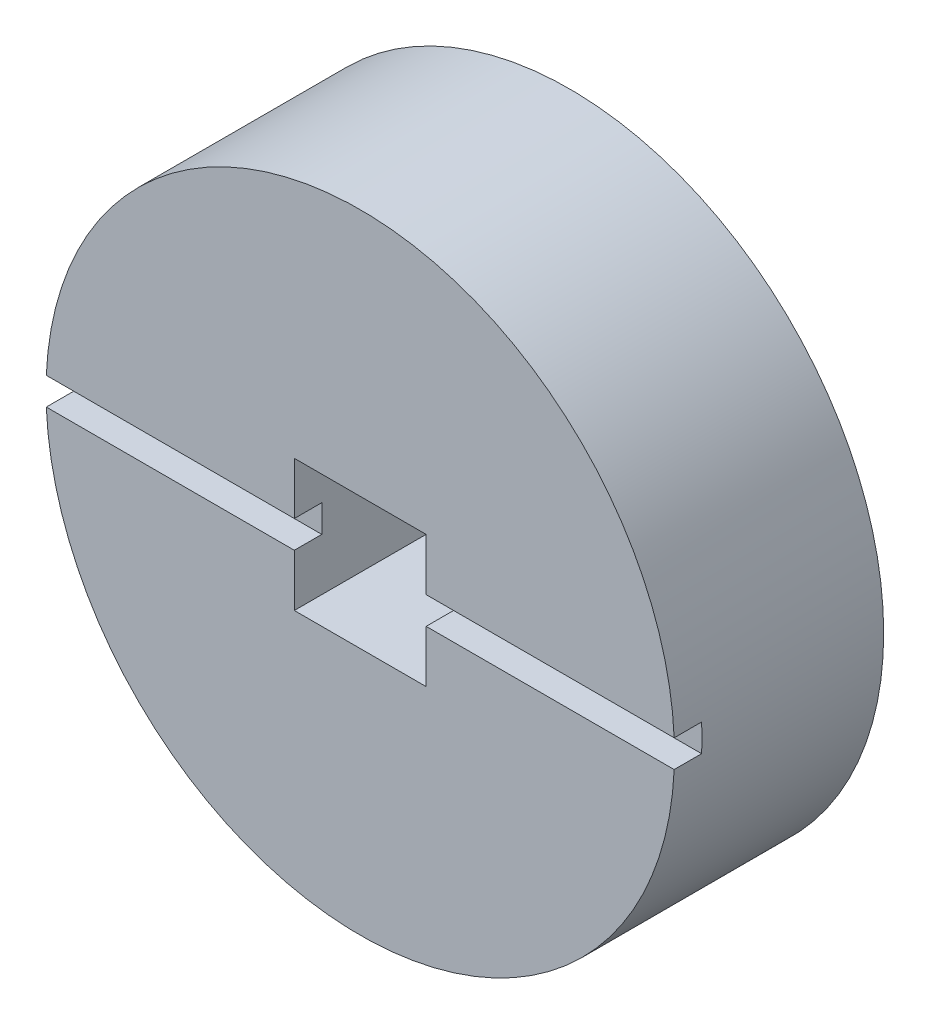
ISO-10303-21;
HEADER;
FILE_DESCRIPTION(('STEP AP214'),'2;1');
FILE_NAME('part.step','',(''),(''),'','','');
FILE_SCHEMA(('AUTOMOTIVE_DESIGN { 1 0 10303 214 1 1 1 1 }'));
ENDSEC;
DATA;
#1=APPLICATION_CONTEXT('core data for automotive mechanical design processes');
#2=APPLICATION_PROTOCOL_DEFINITION('international standard','automotive_design',2000,#1);
#3=PRODUCT_CONTEXT('',#1,'mechanical');
#4=PRODUCT('Part','Part','',(#3));
#5=PRODUCT_RELATED_PRODUCT_CATEGORY('part','',(#4));
#6=PRODUCT_DEFINITION_FORMATION('','',#4);
#7=PRODUCT_DEFINITION_CONTEXT('part definition',#1,'design');
#8=PRODUCT_DEFINITION('design','',#6,#7);
#9=PRODUCT_DEFINITION_SHAPE('','',#8);
#10=(LENGTH_UNIT() NAMED_UNIT(*) SI_UNIT(.MILLI.,.METRE.));
#11=(NAMED_UNIT(*) PLANE_ANGLE_UNIT() SI_UNIT($,.RADIAN.));
#12=(NAMED_UNIT(*) SI_UNIT($,.STERADIAN.) SOLID_ANGLE_UNIT());
#13=UNCERTAINTY_MEASURE_WITH_UNIT(LENGTH_MEASURE(1.E-05),#10,'distance_accuracy_value','');
#14=(GEOMETRIC_REPRESENTATION_CONTEXT(3) GLOBAL_UNCERTAINTY_ASSIGNED_CONTEXT((#13)) GLOBAL_UNIT_ASSIGNED_CONTEXT((#10,
#11,#12)) REPRESENTATION_CONTEXT('',''));
#15=CARTESIAN_POINT('',(0.,0.,0.));
#16=DIRECTION('',(0.,0.,1.));
#17=DIRECTION('',(1.,0.,0.));
#18=AXIS2_PLACEMENT_3D('',#15,#16,#17);
#19=CARTESIAN_POINT('',(172.38008866037,-0.678024563986218,0.307578713654492));
#20=DIRECTION('',(0.,0.,-1.));
#21=DIRECTION('',(-1.,0.,0.));
#22=AXIS2_PLACEMENT_3D('',#19,#20,#21);
#23=CYLINDRICAL_SURFACE('',#22,5.72140557275509);
#24=CARTESIAN_POINT('',(172.38008866037,-0.678024563986218,-19.685));
#25=DIRECTION('',(0.,0.,1.));
#26=DIRECTION('',(1.,0.,0.));
#27=AXIS2_PLACEMENT_3D('',#24,#25,#26);
#28=CIRCLE('',#27,5.72140557275509);
#29=CARTESIAN_POINT('',(178.101494233125,-0.678024563986218,-19.685));
#30=VERTEX_POINT('',#29);
#31=EDGE_CURVE('E183',#30,#30,#28,.T.);
#32=ORIENTED_EDGE('',*,*,#31,.T.);
#33=EDGE_LOOP('',(#32));
#34=FACE_BOUND('',#33,.T.);
#35=DIRECTION('',(0.,0.,-1.));
#36=VECTOR('',#35,1.);
#37=CARTESIAN_POINT('',(166.664147641784,-0.428024563986249,0.307578713654492));
#38=LINE('',#37,#36);
#39=CARTESIAN_POINT('',(166.664147641784,-0.428024563986249,-15.875));
#40=VERTEX_POINT('',#39);
#41=CARTESIAN_POINT('',(166.664147641784,-0.428024563986249,-16.375));
#42=VERTEX_POINT('',#41);
#43=EDGE_CURVE('E153',#40,#42,#38,.T.);
#44=ORIENTED_EDGE('',*,*,#43,.F.);
#45=CARTESIAN_POINT('',(172.38008866037,-0.678024563986218,-15.875));
#46=DIRECTION('',(0.,0.,-1.));
#47=DIRECTION('',(-1.,0.,0.));
#48=AXIS2_PLACEMENT_3D('',#45,#46,#47);
#49=CIRCLE('',#48,5.72140557275509);
#50=CARTESIAN_POINT('',(178.096029678956,-0.428024563986249,-15.875));
#51=VERTEX_POINT('',#50);
#52=EDGE_CURVE('E193',#40,#51,#49,.T.);
#53=ORIENTED_EDGE('',*,*,#52,.T.);
#54=DIRECTION('',(0.,0.,-1.));
#55=VECTOR('',#54,1.);
#56=CARTESIAN_POINT('',(178.096029678956,-0.428024563986249,0.307578713654492));
#57=LINE('',#56,#55);
#58=CARTESIAN_POINT('',(178.096029678956,-0.428024563986249,-16.375));
#59=VERTEX_POINT('',#58);
#60=EDGE_CURVE('E147',#59,#51,#57,.F.);
#61=ORIENTED_EDGE('',*,*,#60,.F.);
#62=CARTESIAN_POINT('',(172.38008866037,-0.678024563986218,-16.375));
#63=DIRECTION('',(0.,0.,1.));
#64=DIRECTION('',(1.,0.,0.));
#65=AXIS2_PLACEMENT_3D('',#62,#63,#64);
#66=CIRCLE('',#65,5.72140557275509);
#67=CARTESIAN_POINT('',(178.096029678956,-0.928024563986249,-16.375));
#68=VERTEX_POINT('',#67);
#69=EDGE_CURVE('E133',#68,#59,#66,.T.);
#70=ORIENTED_EDGE('',*,*,#69,.F.);
#71=DIRECTION('',(0.,0.,-1.));
#72=VECTOR('',#71,1.);
#73=CARTESIAN_POINT('',(178.096029678956,-0.928024563986249,0.307578713654492));
#74=LINE('',#73,#72);
#75=CARTESIAN_POINT('',(178.096029678956,-0.928024563986249,-15.875));
#76=VERTEX_POINT('',#75);
#77=EDGE_CURVE('E145',#68,#76,#74,.F.);
#78=ORIENTED_EDGE('',*,*,#77,.T.);
#79=CARTESIAN_POINT('',(166.664147641784,-0.928024563986249,-15.875));
#80=VERTEX_POINT('',#79);
#81=EDGE_CURVE('E143',#76,#80,#49,.T.);
#82=ORIENTED_EDGE('',*,*,#81,.T.);
#83=DIRECTION('',(0.,0.,-1.));
#84=VECTOR('',#83,1.);
#85=CARTESIAN_POINT('',(166.664147641784,-0.928024563986249,0.307578713654492));
#86=LINE('',#85,#84);
#87=CARTESIAN_POINT('',(166.664147641784,-0.928024563986249,-16.375));
#88=VERTEX_POINT('',#87);
#89=EDGE_CURVE('E136',#80,#88,#86,.T.);
#90=ORIENTED_EDGE('',*,*,#89,.T.);
#91=EDGE_CURVE('E122',#42,#88,#66,.T.);
#92=ORIENTED_EDGE('',*,*,#91,.F.);
#93=EDGE_LOOP('',(#44,#53,#61,#70,#78,#82,#90,#92));
#94=FACE_BOUND('',#93,.T.);
#95=ADVANCED_FACE('F33',(#34,#94),#23,.T.);
#96=CARTESIAN_POINT('',(24.548886356747,5.38318285887093,-15.875));
#97=DIRECTION('',(0.,0.,-1.));
#98=DIRECTION('',(-1.,0.,0.));
#99=AXIS2_PLACEMENT_3D('',#96,#97,#98);
#100=PLANE('',#99);
#101=DIRECTION('',(1.,0.,0.));
#102=VECTOR('',#101,1.);
#103=CARTESIAN_POINT('',(154.564002452123,-0.428024563986249,-15.875));
#104=LINE('',#103,#102);
#105=CARTESIAN_POINT('',(173.58008866037,-0.428024563986249,-15.875));
#106=VERTEX_POINT('',#105);
#107=EDGE_CURVE('E214',#106,#51,#104,.T.);
#108=ORIENTED_EDGE('',*,*,#107,.T.);
#109=ORIENTED_EDGE('',*,*,#52,.F.);
#110=CARTESIAN_POINT('',(171.18008866037,-0.428024563986249,-15.875));
#111=VERTEX_POINT('',#110);
#112=EDGE_CURVE('E216',#40,#111,#104,.T.);
#113=ORIENTED_EDGE('',*,*,#112,.T.);
#114=DIRECTION('',(0.,-1.,0.));
#115=VECTOR('',#114,1.);
#116=CARTESIAN_POINT('',(171.18008866037,0.52197543601375,-15.875));
#117=LINE('',#116,#115);
#118=CARTESIAN_POINT('',(171.18008866037,0.52197543601375,-15.875));
#119=VERTEX_POINT('',#118);
#120=EDGE_CURVE('E169',#119,#111,#117,.T.);
#121=ORIENTED_EDGE('',*,*,#120,.F.);
#122=DIRECTION('',(1.,0.,0.));
#123=VECTOR('',#122,1.);
#124=CARTESIAN_POINT('',(171.18008866037,0.52197543601375,-15.875));
#125=LINE('',#124,#123);
#126=CARTESIAN_POINT('',(173.58008866037,0.52197543601375,-15.875));
#127=VERTEX_POINT('',#126);
#128=EDGE_CURVE('E161',#119,#127,#125,.T.);
#129=ORIENTED_EDGE('',*,*,#128,.T.);
#130=DIRECTION('',(0.,-1.,0.));
#131=VECTOR('',#130,1.);
#132=CARTESIAN_POINT('',(173.58008866037,0.52197543601375,-15.875));
#133=LINE('',#132,#131);
#134=EDGE_CURVE('E176',#127,#106,#133,.T.);
#135=ORIENTED_EDGE('',*,*,#134,.T.);
#136=EDGE_LOOP('',(#108,#109,#113,#121,#129,#135));
#137=FACE_BOUND('',#136,.T.);
#138=ADVANCED_FACE('F240',(#137),#100,.F.);
#139=CARTESIAN_POINT('',(171.18008866037,0.52197543601375,-18.795));
#140=DIRECTION('',(-1.,0.,0.));
#141=DIRECTION('',(0.,0.,1.));
#142=AXIS2_PLACEMENT_3D('',#139,#140,#141);
#143=PLANE('',#142);
#144=DIRECTION('',(0.,0.,1.));
#145=VECTOR('',#144,1.);
#146=CARTESIAN_POINT('',(171.18008866037,-0.428024563986249,-18.795));
#147=LINE('',#146,#145);
#148=CARTESIAN_POINT('',(171.18008866037,-0.428024563986249,-16.375));
#149=VERTEX_POINT('',#148);
#150=EDGE_CURVE('E144',#149,#111,#147,.T.);
#151=ORIENTED_EDGE('',*,*,#150,.F.);
#152=DIRECTION('',(0.,1.,0.));
#153=VECTOR('',#152,1.);
#154=CARTESIAN_POINT('',(171.18008866037,0.52197543601375,-16.375));
#155=LINE('',#154,#153);
#156=CARTESIAN_POINT('',(171.18008866037,-0.928024563986249,-16.375));
#157=VERTEX_POINT('',#156);
#158=EDGE_CURVE('E155',#157,#149,#155,.T.);
#159=ORIENTED_EDGE('',*,*,#158,.F.);
#160=DIRECTION('',(0.,0.,1.));
#161=VECTOR('',#160,1.);
#162=CARTESIAN_POINT('',(171.18008866037,-0.928024563986249,-18.795));
#163=LINE('',#162,#161);
#164=CARTESIAN_POINT('',(171.18008866037,-0.928024563986249,-15.875));
#165=VERTEX_POINT('',#164);
#166=EDGE_CURVE('E137',#157,#165,#163,.T.);
#167=ORIENTED_EDGE('',*,*,#166,.T.);
#168=CARTESIAN_POINT('',(171.18008866037,-1.87802456398625,-15.875));
#169=VERTEX_POINT('',#168);
#170=EDGE_CURVE('E132',#165,#169,#117,.T.);
#171=ORIENTED_EDGE('',*,*,#170,.T.);
#172=DIRECTION('',(0.,0.,1.));
#173=VECTOR('',#172,1.);
#174=CARTESIAN_POINT('',(171.18008866037,-1.87802456398625,-18.795));
#175=LINE('',#174,#173);
#176=CARTESIAN_POINT('',(171.18008866037,-1.87802456398625,-18.795));
#177=VERTEX_POINT('',#176);
#178=EDGE_CURVE('E168',#177,#169,#175,.T.);
#179=ORIENTED_EDGE('',*,*,#178,.F.);
#180=DIRECTION('',(0.,-1.,0.));
#181=VECTOR('',#180,1.);
#182=CARTESIAN_POINT('',(171.18008866037,0.52197543601375,-18.795));
#183=LINE('',#182,#181);
#184=CARTESIAN_POINT('',(171.18008866037,0.52197543601375,-18.795));
#185=VERTEX_POINT('',#184);
#186=EDGE_CURVE('E157',#185,#177,#183,.T.);
#187=ORIENTED_EDGE('',*,*,#186,.F.);
#188=DIRECTION('',(0.,0.,1.));
#189=VECTOR('',#188,1.);
#190=CARTESIAN_POINT('',(171.18008866037,0.52197543601375,-18.795));
#191=LINE('',#190,#189);
#192=EDGE_CURVE('E181',#185,#119,#191,.T.);
#193=ORIENTED_EDGE('',*,*,#192,.T.);
#194=ORIENTED_EDGE('',*,*,#120,.T.);
#195=EDGE_LOOP('',(#151,#159,#167,#171,#179,#187,#193,#194));
#196=FACE_BOUND('',#195,.T.);
#197=ADVANCED_FACE('F220',(#196),#143,.F.);
#198=CARTESIAN_POINT('',(173.58008866037,0.52197543601375,-18.795));
#199=DIRECTION('',(-1.,0.,0.));
#200=DIRECTION('',(0.,0.,1.));
#201=AXIS2_PLACEMENT_3D('',#198,#199,#200);
#202=PLANE('',#201);
#203=DIRECTION('',(0.,1.,0.));
#204=VECTOR('',#203,1.);
#205=CARTESIAN_POINT('',(173.58008866037,0.52197543601375,-16.375));
#206=LINE('',#205,#204);
#207=CARTESIAN_POINT('',(173.58008866037,-0.928024563986249,-16.375));
#208=VERTEX_POINT('',#207);
#209=CARTESIAN_POINT('',(173.58008866037,-0.428024563986249,-16.375));
#210=VERTEX_POINT('',#209);
#211=EDGE_CURVE('E40',#208,#210,#206,.T.);
#212=ORIENTED_EDGE('',*,*,#211,.T.);
#213=DIRECTION('',(0.,0.,1.));
#214=VECTOR('',#213,1.);
#215=CARTESIAN_POINT('',(173.58008866037,-0.428024563986249,-18.795));
#216=LINE('',#215,#214);
#217=EDGE_CURVE('E11',#210,#106,#216,.T.);
#218=ORIENTED_EDGE('',*,*,#217,.T.);
#219=ORIENTED_EDGE('',*,*,#134,.F.);
#220=DIRECTION('',(0.,0.,1.));
#221=VECTOR('',#220,1.);
#222=CARTESIAN_POINT('',(173.58008866037,0.52197543601375,-18.795));
#223=LINE('',#222,#221);
#224=CARTESIAN_POINT('',(173.58008866037,0.52197543601375,-18.795));
#225=VERTEX_POINT('',#224);
#226=EDGE_CURVE('E184',#225,#127,#223,.T.);
#227=ORIENTED_EDGE('',*,*,#226,.F.);
#228=DIRECTION('',(0.,-1.,0.));
#229=VECTOR('',#228,1.);
#230=CARTESIAN_POINT('',(173.58008866037,0.52197543601375,-18.795));
#231=LINE('',#230,#229);
#232=CARTESIAN_POINT('',(173.58008866037,-1.87802456398625,-18.795));
#233=VERTEX_POINT('',#232);
#234=EDGE_CURVE('E164',#225,#233,#231,.T.);
#235=ORIENTED_EDGE('',*,*,#234,.T.);
#236=DIRECTION('',(0.,0.,1.));
#237=VECTOR('',#236,1.);
#238=CARTESIAN_POINT('',(173.58008866037,-1.87802456398625,-18.795));
#239=LINE('',#238,#237);
#240=CARTESIAN_POINT('',(173.58008866037,-1.87802456398625,-15.875));
#241=VERTEX_POINT('',#240);
#242=EDGE_CURVE('E186',#233,#241,#239,.T.);
#243=ORIENTED_EDGE('',*,*,#242,.T.);
#244=CARTESIAN_POINT('',(173.58008866037,-0.928024563986249,-15.875));
#245=VERTEX_POINT('',#244);
#246=EDGE_CURVE('E175',#245,#241,#133,.T.);
#247=ORIENTED_EDGE('',*,*,#246,.F.);
#248=DIRECTION('',(0.,0.,1.));
#249=VECTOR('',#248,1.);
#250=CARTESIAN_POINT('',(173.58008866037,-0.928024563986249,-18.795));
#251=LINE('',#250,#249);
#252=EDGE_CURVE('E196',#208,#245,#251,.T.);
#253=ORIENTED_EDGE('',*,*,#252,.F.);
#254=EDGE_LOOP('',(#212,#218,#219,#227,#235,#243,#247,#253));
#255=FACE_BOUND('',#254,.T.);
#256=ADVANCED_FACE('F200',(#255),#202,.T.);
#257=CARTESIAN_POINT('',(172.38008866037,-0.678024563986218,-19.685));
#258=DIRECTION('',(0.,0.,1.));
#259=DIRECTION('',(1.,0.,0.));
#260=AXIS2_PLACEMENT_3D('',#257,#258,#259);
#261=PLANE('',#260);
#262=ORIENTED_EDGE('',*,*,#31,.F.);
#263=EDGE_LOOP('',(#262));
#264=FACE_BOUND('',#263,.T.);
#265=ADVANCED_FACE('F265',(#264),#261,.F.);
#266=ORIENTED_EDGE('',*,*,#81,.F.);
#267=DIRECTION('',(1.,0.,0.));
#268=VECTOR('',#267,1.);
#269=CARTESIAN_POINT('',(154.564002452123,-0.928024563986249,-15.875));
#270=LINE('',#269,#268);
#271=EDGE_CURVE('E212',#245,#76,#270,.T.);
#272=ORIENTED_EDGE('',*,*,#271,.F.);
#273=ORIENTED_EDGE('',*,*,#246,.T.);
#274=DIRECTION('',(1.,0.,0.));
#275=VECTOR('',#274,1.);
#276=CARTESIAN_POINT('',(171.18008866037,-1.87802456398625,-15.875));
#277=LINE('',#276,#275);
#278=EDGE_CURVE('E172',#169,#241,#277,.T.);
#279=ORIENTED_EDGE('',*,*,#278,.F.);
#280=ORIENTED_EDGE('',*,*,#170,.F.);
#281=EDGE_CURVE('E47',#80,#165,#270,.T.);
#282=ORIENTED_EDGE('',*,*,#281,.F.);
#283=EDGE_LOOP('',(#266,#272,#273,#279,#280,#282));
#284=FACE_BOUND('',#283,.T.);
#285=ADVANCED_FACE('F223',(#284),#100,.F.);
#286=CARTESIAN_POINT('',(171.18008866037,0.52197543601375,-18.795));
#287=DIRECTION('',(0.,-1.,0.));
#288=DIRECTION('',(0.,0.,-1.));
#289=AXIS2_PLACEMENT_3D('',#286,#287,#288);
#290=PLANE('',#289);
#291=ORIENTED_EDGE('',*,*,#128,.F.);
#292=ORIENTED_EDGE('',*,*,#192,.F.);
#293=DIRECTION('',(1.,0.,0.));
#294=VECTOR('',#293,1.);
#295=CARTESIAN_POINT('',(171.18008866037,0.52197543601375,-18.795));
#296=LINE('',#295,#294);
#297=EDGE_CURVE('E166',#185,#225,#296,.T.);
#298=ORIENTED_EDGE('',*,*,#297,.T.);
#299=ORIENTED_EDGE('',*,*,#226,.T.);
#300=EDGE_LOOP('',(#291,#292,#298,#299));
#301=FACE_BOUND('',#300,.T.);
#302=ADVANCED_FACE('F237',(#301),#290,.T.);
#303=CARTESIAN_POINT('',(171.18008866037,-1.87802456398625,-18.795));
#304=DIRECTION('',(0.,-1.,0.));
#305=DIRECTION('',(0.,0.,-1.));
#306=AXIS2_PLACEMENT_3D('',#303,#304,#305);
#307=PLANE('',#306);
#308=ORIENTED_EDGE('',*,*,#278,.T.);
#309=ORIENTED_EDGE('',*,*,#242,.F.);
#310=DIRECTION('',(1.,0.,0.));
#311=VECTOR('',#310,1.);
#312=CARTESIAN_POINT('',(171.18008866037,-1.87802456398625,-18.795));
#313=LINE('',#312,#311);
#314=EDGE_CURVE('E160',#177,#233,#313,.T.);
#315=ORIENTED_EDGE('',*,*,#314,.F.);
#316=ORIENTED_EDGE('',*,*,#178,.T.);
#317=EDGE_LOOP('',(#308,#309,#315,#316));
#318=FACE_BOUND('',#317,.T.);
#319=ADVANCED_FACE('F227',(#318),#307,.F.);
#320=CARTESIAN_POINT('',(0.,0.,-18.795));
#321=DIRECTION('',(0.,0.,1.));
#322=DIRECTION('',(1.,0.,0.));
#323=AXIS2_PLACEMENT_3D('',#320,#321,#322);
#324=PLANE('',#323);
#325=ORIENTED_EDGE('',*,*,#186,.T.);
#326=ORIENTED_EDGE('',*,*,#314,.T.);
#327=ORIENTED_EDGE('',*,*,#234,.F.);
#328=ORIENTED_EDGE('',*,*,#297,.F.);
#329=EDGE_LOOP('',(#325,#326,#327,#328));
#330=FACE_BOUND('',#329,.T.);
#331=ADVANCED_FACE('F233',(#330),#324,.T.);
#332=CARTESIAN_POINT('',(154.564002452123,-0.428024563986249,-16.375));
#333=DIRECTION('',(0.,-1.,0.));
#334=DIRECTION('',(0.,0.,-1.));
#335=AXIS2_PLACEMENT_3D('',#332,#333,#334);
#336=PLANE('',#335);
#337=ORIENTED_EDGE('',*,*,#60,.T.);
#338=ORIENTED_EDGE('',*,*,#107,.F.);
#339=ORIENTED_EDGE('',*,*,#217,.F.);
#340=DIRECTION('',(1.,0.,0.));
#341=VECTOR('',#340,1.);
#342=CARTESIAN_POINT('',(154.564002452123,-0.428024563986249,-16.375));
#343=LINE('',#342,#341);
#344=EDGE_CURVE('E138',#210,#59,#343,.T.);
#345=ORIENTED_EDGE('',*,*,#344,.T.);
#346=EDGE_LOOP('',(#337,#338,#339,#345));
#347=FACE_BOUND('',#346,.T.);
#348=ADVANCED_FACE('F245',(#347),#336,.T.);
#349=CARTESIAN_POINT('',(154.564002452123,-0.928024563986249,-16.375));
#350=DIRECTION('',(0.,-1.,0.));
#351=DIRECTION('',(0.,0.,-1.));
#352=AXIS2_PLACEMENT_3D('',#349,#350,#351);
#353=PLANE('',#352);
#354=DIRECTION('',(1.,0.,0.));
#355=VECTOR('',#354,1.);
#356=CARTESIAN_POINT('',(154.564002452123,-0.928024563986249,-16.375));
#357=LINE('',#356,#355);
#358=EDGE_CURVE('E55',#208,#68,#357,.T.);
#359=ORIENTED_EDGE('',*,*,#358,.F.);
#360=ORIENTED_EDGE('',*,*,#252,.T.);
#361=ORIENTED_EDGE('',*,*,#271,.T.);
#362=ORIENTED_EDGE('',*,*,#77,.F.);
#363=EDGE_LOOP('',(#359,#360,#361,#362));
#364=FACE_BOUND('',#363,.T.);
#365=ADVANCED_FACE('F246',(#364),#353,.F.);
#366=CARTESIAN_POINT('',(0.,0.,-16.375));
#367=DIRECTION('',(0.,0.,1.));
#368=DIRECTION('',(1.,0.,0.));
#369=AXIS2_PLACEMENT_3D('',#366,#367,#368);
#370=PLANE('',#369);
#371=ORIENTED_EDGE('',*,*,#69,.T.);
#372=ORIENTED_EDGE('',*,*,#344,.F.);
#373=ORIENTED_EDGE('',*,*,#211,.F.);
#374=ORIENTED_EDGE('',*,*,#358,.T.);
#375=EDGE_LOOP('',(#371,#372,#373,#374));
#376=FACE_BOUND('',#375,.T.);
#377=ADVANCED_FACE('F205',(#376),#370,.T.);
#378=ORIENTED_EDGE('',*,*,#91,.T.);
#379=EDGE_CURVE('E125',#88,#157,#357,.T.);
#380=ORIENTED_EDGE('',*,*,#379,.T.);
#381=ORIENTED_EDGE('',*,*,#158,.T.);
#382=EDGE_CURVE('E128',#42,#149,#343,.T.);
#383=ORIENTED_EDGE('',*,*,#382,.F.);
#384=EDGE_LOOP('',(#378,#380,#381,#383));
#385=FACE_BOUND('',#384,.T.);
#386=ADVANCED_FACE('F124',(#385),#370,.T.);
#387=ORIENTED_EDGE('',*,*,#43,.T.);
#388=ORIENTED_EDGE('',*,*,#382,.T.);
#389=ORIENTED_EDGE('',*,*,#150,.T.);
#390=ORIENTED_EDGE('',*,*,#112,.F.);
#391=EDGE_LOOP('',(#387,#388,#389,#390));
#392=FACE_BOUND('',#391,.T.);
#393=ADVANCED_FACE('F244',(#392),#336,.T.);
#394=ORIENTED_EDGE('',*,*,#281,.T.);
#395=ORIENTED_EDGE('',*,*,#166,.F.);
#396=ORIENTED_EDGE('',*,*,#379,.F.);
#397=ORIENTED_EDGE('',*,*,#89,.F.);
#398=EDGE_LOOP('',(#394,#395,#396,#397));
#399=FACE_BOUND('',#398,.T.);
#400=ADVANCED_FACE('F135',(#399),#353,.F.);
#401=CLOSED_SHELL('',(#95,#138,#197,#256,#265,#285,#302,#319,#331,#348,#365,#377,#386,#393,#400));
#402=MANIFOLD_SOLID_BREP('B2',#401);
#403=ADVANCED_BREP_SHAPE_REPRESENTATION('',(#18,#402),#14);
#404=SHAPE_DEFINITION_REPRESENTATION(#9,#403);
ENDSEC;
END-ISO-10303-21;
